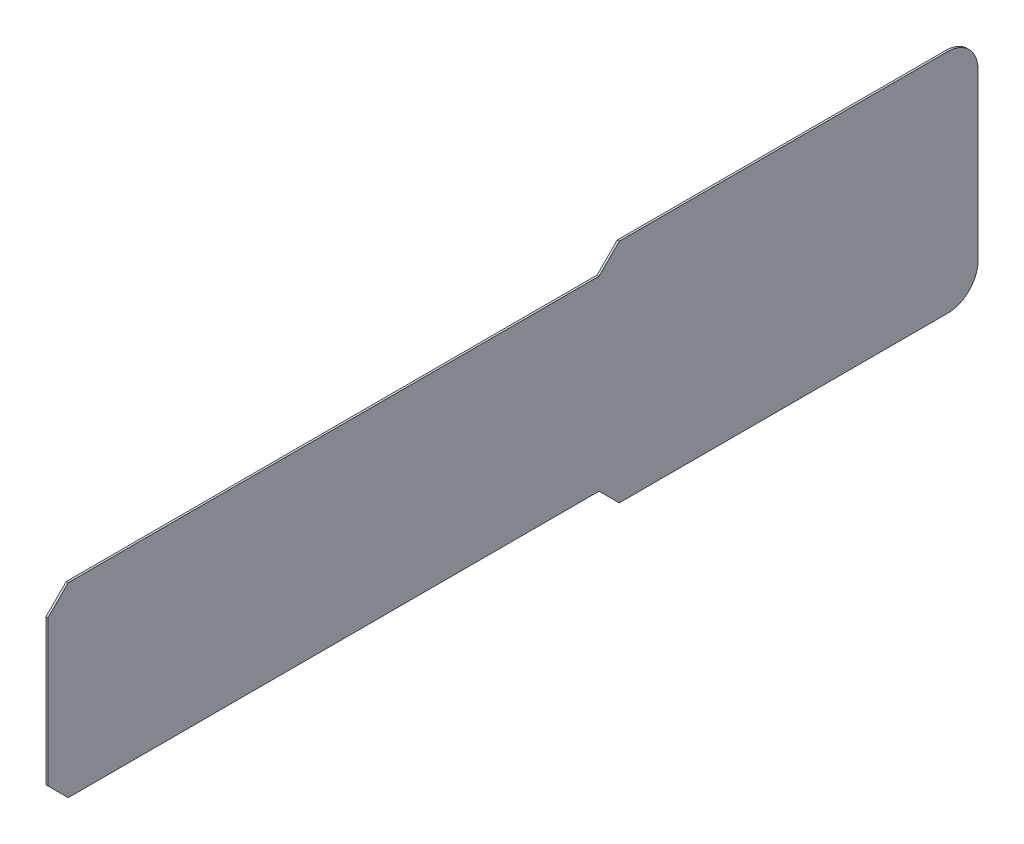
ISO-10303-21;
HEADER;
FILE_DESCRIPTION(('STEP AP214'),'2;1');
FILE_NAME('part.step','',(''),(''),'','','');
FILE_SCHEMA(('AUTOMOTIVE_DESIGN { 1 0 10303 214 1 1 1 1 }'));
ENDSEC;
DATA;
#1=APPLICATION_CONTEXT('core data for automotive mechanical design processes');
#2=APPLICATION_PROTOCOL_DEFINITION('international standard','automotive_design',2000,#1);
#3=PRODUCT_CONTEXT('',#1,'mechanical');
#4=PRODUCT('Part','Part','',(#3));
#5=PRODUCT_RELATED_PRODUCT_CATEGORY('part','',(#4));
#6=PRODUCT_DEFINITION_FORMATION('','',#4);
#7=PRODUCT_DEFINITION_CONTEXT('part definition',#1,'design');
#8=PRODUCT_DEFINITION('design','',#6,#7);
#9=PRODUCT_DEFINITION_SHAPE('','',#8);
#10=(LENGTH_UNIT() NAMED_UNIT(*) SI_UNIT(.MILLI.,.METRE.));
#11=(NAMED_UNIT(*) PLANE_ANGLE_UNIT() SI_UNIT($,.RADIAN.));
#12=(NAMED_UNIT(*) SI_UNIT($,.STERADIAN.) SOLID_ANGLE_UNIT());
#13=UNCERTAINTY_MEASURE_WITH_UNIT(LENGTH_MEASURE(1.E-05),#10,'distance_accuracy_value','');
#14=(GEOMETRIC_REPRESENTATION_CONTEXT(3) GLOBAL_UNCERTAINTY_ASSIGNED_CONTEXT((#13)) GLOBAL_UNIT_ASSIGNED_CONTEXT((#10,
#11,#12)) REPRESENTATION_CONTEXT('',''));
#15=CARTESIAN_POINT('',(0.,0.,0.));
#16=DIRECTION('',(0.,0.,1.));
#17=DIRECTION('',(1.,0.,0.));
#18=AXIS2_PLACEMENT_3D('',#15,#16,#17);
#19=CARTESIAN_POINT('',(-0.2,-35.603076923077,-25.6615384615385));
#20=DIRECTION('',(1.,0.,0.));
#21=DIRECTION('',(0.,0.,-1.));
#22=AXIS2_PLACEMENT_3D('',#19,#20,#21);
#23=CYLINDRICAL_SURFACE('',#22,3.);
#24=DIRECTION('',(1.,0.,0.));
#25=VECTOR('',#24,1.);
#26=CARTESIAN_POINT('',(-0.2,-35.603076923077,-28.6615384615385));
#27=LINE('',#26,#25);
#28=CARTESIAN_POINT('',(-0.2,-35.603076923077,-28.6615384615385));
#29=VERTEX_POINT('',#28);
#30=CARTESIAN_POINT('',(0.,-35.603076923077,-28.6615384615385));
#31=VERTEX_POINT('',#30);
#32=EDGE_CURVE('E189',#29,#31,#27,.T.);
#33=ORIENTED_EDGE('',*,*,#32,.F.);
#34=CARTESIAN_POINT('',(-0.2,-35.603076923077,-25.6615384615385));
#35=DIRECTION('',(1.,0.,0.));
#36=DIRECTION('',(0.,0.,-1.));
#37=AXIS2_PLACEMENT_3D('',#34,#35,#36);
#38=CIRCLE('',#37,3.);
#39=CARTESIAN_POINT('',(-0.2,-32.603076923077,-25.6615384615385));
#40=VERTEX_POINT('',#39);
#41=EDGE_CURVE('E39',#40,#29,#38,.F.);
#42=ORIENTED_EDGE('',*,*,#41,.F.);
#43=DIRECTION('',(1.,0.,0.));
#44=VECTOR('',#43,1.);
#45=CARTESIAN_POINT('',(-0.2,-32.603076923077,-25.6615384615385));
#46=LINE('',#45,#44);
#47=CARTESIAN_POINT('',(0.,-32.603076923077,-25.6615384615385));
#48=VERTEX_POINT('',#47);
#49=EDGE_CURVE('E192',#48,#40,#46,.F.);
#50=ORIENTED_EDGE('',*,*,#49,.F.);
#51=CARTESIAN_POINT('',(0.,-35.603076923077,-25.6615384615385));
#52=DIRECTION('',(1.,0.,0.));
#53=DIRECTION('',(0.,0.,-1.));
#54=AXIS2_PLACEMENT_3D('',#51,#52,#53);
#55=CIRCLE('',#54,3.);
#56=EDGE_CURVE('E11',#31,#48,#55,.T.);
#57=ORIENTED_EDGE('',*,*,#56,.F.);
#58=EDGE_LOOP('',(#33,#42,#50,#57));
#59=FACE_BOUND('',#58,.T.);
#60=ADVANCED_FACE('F32',(#59),#23,.T.);
#61=CARTESIAN_POINT('',(-0.2,-52.0230769230769,-25.6615384615385));
#62=DIRECTION('',(1.,0.,0.));
#63=DIRECTION('',(0.,0.,-1.));
#64=AXIS2_PLACEMENT_3D('',#61,#62,#63);
#65=CYLINDRICAL_SURFACE('',#64,3.);
#66=DIRECTION('',(-1.,0.,0.));
#67=VECTOR('',#66,1.);
#68=CARTESIAN_POINT('',(-0.2,-52.0230769230769,-28.6615384615385));
#69=LINE('',#68,#67);
#70=CARTESIAN_POINT('',(0.,-52.0230769230769,-28.6615384615385));
#71=VERTEX_POINT('',#70);
#72=CARTESIAN_POINT('',(-0.2,-52.0230769230769,-28.6615384615385));
#73=VERTEX_POINT('',#72);
#74=EDGE_CURVE('E171',#71,#73,#69,.T.);
#75=ORIENTED_EDGE('',*,*,#74,.F.);
#76=CARTESIAN_POINT('',(0.,-52.0230769230769,-25.6615384615385));
#77=DIRECTION('',(1.,0.,0.));
#78=DIRECTION('',(0.,0.,-1.));
#79=AXIS2_PLACEMENT_3D('',#76,#77,#78);
#80=CIRCLE('',#79,3.);
#81=CARTESIAN_POINT('',(0.,-55.0230769230769,-25.6615384615385));
#82=VERTEX_POINT('',#81);
#83=EDGE_CURVE('E185',#82,#71,#80,.T.);
#84=ORIENTED_EDGE('',*,*,#83,.F.);
#85=DIRECTION('',(-1.,0.,0.));
#86=VECTOR('',#85,1.);
#87=CARTESIAN_POINT('',(-0.2,-55.0230769230769,-25.6615384615385));
#88=LINE('',#87,#86);
#89=CARTESIAN_POINT('',(-0.2,-55.0230769230769,-25.6615384615385));
#90=VERTEX_POINT('',#89);
#91=EDGE_CURVE('E182',#90,#82,#88,.F.);
#92=ORIENTED_EDGE('',*,*,#91,.F.);
#93=CARTESIAN_POINT('',(-0.2,-52.0230769230769,-25.6615384615385));
#94=DIRECTION('',(1.,0.,0.));
#95=DIRECTION('',(0.,0.,-1.));
#96=AXIS2_PLACEMENT_3D('',#93,#94,#95);
#97=CIRCLE('',#96,3.);
#98=EDGE_CURVE('E187',#73,#90,#97,.F.);
#99=ORIENTED_EDGE('',*,*,#98,.F.);
#100=EDGE_LOOP('',(#75,#84,#92,#99));
#101=FACE_BOUND('',#100,.T.);
#102=ADVANCED_FACE('F206',(#101),#65,.T.);
#103=CARTESIAN_POINT('',(-0.2,-55.0230769230769,-28.6615384615385));
#104=DIRECTION('',(0.,0.,-1.));
#105=DIRECTION('',(-1.,0.,0.));
#106=AXIS2_PLACEMENT_3D('',#103,#104,#105);
#107=PLANE('',#106);
#108=DIRECTION('',(0.,1.,0.));
#109=VECTOR('',#108,1.);
#110=CARTESIAN_POINT('',(-0.2,-55.0230769230769,-28.6615384615385));
#111=LINE('',#110,#109);
#112=EDGE_CURVE('E158',#73,#29,#111,.T.);
#113=ORIENTED_EDGE('',*,*,#112,.T.);
#114=ORIENTED_EDGE('',*,*,#32,.T.);
#115=DIRECTION('',(0.,1.,0.));
#116=VECTOR('',#115,1.);
#117=CARTESIAN_POINT('',(0.,-55.0230769230769,-28.6615384615385));
#118=LINE('',#117,#116);
#119=EDGE_CURVE('E157',#71,#31,#118,.T.);
#120=ORIENTED_EDGE('',*,*,#119,.F.);
#121=ORIENTED_EDGE('',*,*,#74,.T.);
#122=EDGE_LOOP('',(#113,#114,#120,#121));
#123=FACE_BOUND('',#122,.T.);
#124=ADVANCED_FACE('F203',(#123),#107,.T.);
#125=CARTESIAN_POINT('',(-0.2,-55.0230769230769,-28.6615384615385));
#126=DIRECTION('',(0.,1.,0.));
#127=DIRECTION('',(0.,0.,1.));
#128=AXIS2_PLACEMENT_3D('',#125,#126,#127);
#129=PLANE('',#128);
#130=DIRECTION('',(0.,0.,1.));
#131=VECTOR('',#130,1.);
#132=CARTESIAN_POINT('',(0.,-55.0230769230769,-28.6615384615385));
#133=LINE('',#132,#131);
#134=CARTESIAN_POINT('',(0.,-55.0230769230769,6.82846153846155));
#135=VERTEX_POINT('',#134);
#136=EDGE_CURVE('E162',#82,#135,#133,.T.);
#137=ORIENTED_EDGE('',*,*,#136,.T.);
#138=DIRECTION('',(-1.,0.,0.));
#139=VECTOR('',#138,1.);
#140=CARTESIAN_POINT('',(0.,-55.0230769230769,6.82846153846155));
#141=LINE('',#140,#139);
#142=CARTESIAN_POINT('',(-0.200000000000003,-55.0230769230769,6.82846153846155));
#143=VERTEX_POINT('',#142);
#144=EDGE_CURVE('E216',#135,#143,#141,.T.);
#145=ORIENTED_EDGE('',*,*,#144,.T.);
#146=DIRECTION('',(0.,0.,1.));
#147=VECTOR('',#146,1.);
#148=CARTESIAN_POINT('',(-0.2,-55.0230769230769,-28.6615384615385));
#149=LINE('',#148,#147);
#150=EDGE_CURVE('E168',#90,#143,#149,.T.);
#151=ORIENTED_EDGE('',*,*,#150,.F.);
#152=ORIENTED_EDGE('',*,*,#91,.T.);
#153=EDGE_LOOP('',(#137,#145,#151,#152));
#154=FACE_BOUND('',#153,.T.);
#155=ADVANCED_FACE('F214',(#154),#129,.F.);
#156=CARTESIAN_POINT('',(-0.2,-55.0230769230769,63.3384615384615));
#157=DIRECTION('',(0.,0.,-1.));
#158=DIRECTION('',(-1.,0.,0.));
#159=AXIS2_PLACEMENT_3D('',#156,#157,#158);
#160=PLANE('',#159);
#161=DIRECTION('',(0.,1.,0.));
#162=VECTOR('',#161,1.);
#163=CARTESIAN_POINT('',(0.,-55.0230769230769,63.3384615384615));
#164=LINE('',#163,#162);
#165=CARTESIAN_POINT('',(0.,-51.0230769230769,63.3384615384615));
#166=VERTEX_POINT('',#165);
#167=CARTESIAN_POINT('',(0.,-36.603076923077,63.3384615384615));
#168=VERTEX_POINT('',#167);
#169=EDGE_CURVE('E175',#166,#168,#164,.T.);
#170=ORIENTED_EDGE('',*,*,#169,.T.);
#171=DIRECTION('',(-1.,0.,0.));
#172=VECTOR('',#171,1.);
#173=CARTESIAN_POINT('',(0.,-36.603076923077,63.3384615384615));
#174=LINE('',#173,#172);
#175=CARTESIAN_POINT('',(-0.200000000000002,-36.603076923077,63.3384615384615));
#176=VERTEX_POINT('',#175);
#177=EDGE_CURVE('E227',#168,#176,#174,.T.);
#178=ORIENTED_EDGE('',*,*,#177,.T.);
#179=DIRECTION('',(0.,1.,0.));
#180=VECTOR('',#179,1.);
#181=CARTESIAN_POINT('',(-0.2,-55.0230769230769,63.3384615384615));
#182=LINE('',#181,#180);
#183=CARTESIAN_POINT('',(-0.200000000000003,-51.0230769230769,63.3384615384615));
#184=VERTEX_POINT('',#183);
#185=EDGE_CURVE('E165',#184,#176,#182,.T.);
#186=ORIENTED_EDGE('',*,*,#185,.F.);
#187=DIRECTION('',(-1.,0.,0.));
#188=VECTOR('',#187,1.);
#189=CARTESIAN_POINT('',(0.,-51.0230769230769,63.3384615384615));
#190=LINE('',#189,#188);
#191=EDGE_CURVE('E147',#166,#184,#190,.T.);
#192=ORIENTED_EDGE('',*,*,#191,.F.);
#193=EDGE_LOOP('',(#170,#178,#186,#192));
#194=FACE_BOUND('',#193,.T.);
#195=ADVANCED_FACE('F242',(#194),#160,.F.);
#196=CARTESIAN_POINT('',(-0.2,-32.603076923077,-28.6615384615385));
#197=DIRECTION('',(0.,1.,0.));
#198=DIRECTION('',(0.,0.,1.));
#199=AXIS2_PLACEMENT_3D('',#196,#197,#198);
#200=PLANE('',#199);
#201=DIRECTION('',(-1.,0.,0.));
#202=VECTOR('',#201,1.);
#203=CARTESIAN_POINT('',(0.,-32.6030769230769,6.82846153846153));
#204=LINE('',#203,#202);
#205=CARTESIAN_POINT('',(0.,-32.6030769230769,6.82846153846153));
#206=VERTEX_POINT('',#205);
#207=CARTESIAN_POINT('',(-0.200000000000002,-32.6030769230769,6.82846153846153));
#208=VERTEX_POINT('',#207);
#209=EDGE_CURVE('E138',#206,#208,#204,.T.);
#210=ORIENTED_EDGE('',*,*,#209,.F.);
#211=DIRECTION('',(0.,0.,1.));
#212=VECTOR('',#211,1.);
#213=CARTESIAN_POINT('',(0.,-32.603076923077,-28.6615384615385));
#214=LINE('',#213,#212);
#215=EDGE_CURVE('E137',#48,#206,#214,.T.);
#216=ORIENTED_EDGE('',*,*,#215,.F.);
#217=ORIENTED_EDGE('',*,*,#49,.T.);
#218=DIRECTION('',(0.,0.,1.));
#219=VECTOR('',#218,1.);
#220=CARTESIAN_POINT('',(-0.2,-32.603076923077,-28.6615384615385));
#221=LINE('',#220,#219);
#222=EDGE_CURVE('E161',#40,#208,#221,.T.);
#223=ORIENTED_EDGE('',*,*,#222,.T.);
#224=EDGE_LOOP('',(#210,#216,#217,#223));
#225=FACE_BOUND('',#224,.T.);
#226=ADVANCED_FACE('F248',(#225),#200,.T.);
#227=CARTESIAN_POINT('',(-0.2,0.,0.));
#228=DIRECTION('',(1.,0.,0.));
#229=DIRECTION('',(0.,0.,-1.));
#230=AXIS2_PLACEMENT_3D('',#227,#228,#229);
#231=PLANE('',#230);
#232=DIRECTION('',(0.,0.,1.));
#233=VECTOR('',#232,1.);
#234=CARTESIAN_POINT('',(-0.200000000000002,-34.603076923077,8.82846153846154));
#235=LINE('',#234,#233);
#236=CARTESIAN_POINT('',(-0.200000000000002,-34.603076923077,8.82846153846154));
#237=VERTEX_POINT('',#236);
#238=CARTESIAN_POINT('',(-0.200000000000002,-34.603076923077,61.3384615384615));
#239=VERTEX_POINT('',#238);
#240=EDGE_CURVE('E142',#237,#239,#235,.T.);
#241=ORIENTED_EDGE('',*,*,#240,.F.);
#242=DIRECTION('',(0.,-0.70710678118655,0.707106781186545));
#243=VECTOR('',#242,1.);
#244=CARTESIAN_POINT('',(-0.200000000000002,-32.6030769230769,6.82846153846153));
#245=LINE('',#244,#243);
#246=EDGE_CURVE('E124',#208,#237,#245,.T.);
#247=ORIENTED_EDGE('',*,*,#246,.F.);
#248=ORIENTED_EDGE('',*,*,#222,.F.);
#249=ORIENTED_EDGE('',*,*,#41,.T.);
#250=ORIENTED_EDGE('',*,*,#112,.F.);
#251=ORIENTED_EDGE('',*,*,#98,.T.);
#252=ORIENTED_EDGE('',*,*,#150,.T.);
#253=DIRECTION('',(0.,-0.707106781186548,-0.707106781186547));
#254=VECTOR('',#253,1.);
#255=CARTESIAN_POINT('',(-0.200000000000003,-55.0230769230769,6.82846153846155));
#256=LINE('',#255,#254);
#257=CARTESIAN_POINT('',(-0.200000000000003,-53.0230769230769,8.82846153846155));
#258=VERTEX_POINT('',#257);
#259=EDGE_CURVE('E211',#258,#143,#256,.T.);
#260=ORIENTED_EDGE('',*,*,#259,.F.);
#261=DIRECTION('',(0.,0.,-1.));
#262=VECTOR('',#261,1.);
#263=CARTESIAN_POINT('',(-0.200000000000003,-53.0230769230769,8.82846153846155));
#264=LINE('',#263,#262);
#265=CARTESIAN_POINT('',(-0.200000000000003,-53.0230769230769,61.3384615384615));
#266=VERTEX_POINT('',#265);
#267=EDGE_CURVE('E129',#266,#258,#264,.T.);
#268=ORIENTED_EDGE('',*,*,#267,.F.);
#269=DIRECTION('',(0.,-0.707106781186547,-0.707106781186547));
#270=VECTOR('',#269,1.);
#271=CARTESIAN_POINT('',(-0.200000000000003,-53.0230769230769,61.3384615384615));
#272=LINE('',#271,#270);
#273=EDGE_CURVE('E54',#184,#266,#272,.T.);
#274=ORIENTED_EDGE('',*,*,#273,.F.);
#275=ORIENTED_EDGE('',*,*,#185,.T.);
#276=DIRECTION('',(0.,-0.707106781186547,0.707106781186547));
#277=VECTOR('',#276,1.);
#278=CARTESIAN_POINT('',(-0.200000000000002,-34.603076923077,61.3384615384615));
#279=LINE('',#278,#277);
#280=EDGE_CURVE('E219',#239,#176,#279,.T.);
#281=ORIENTED_EDGE('',*,*,#280,.F.);
#282=EDGE_LOOP('',(#241,#247,#248,#249,#250,#251,#252,#260,#268,#274,#275,#281));
#283=FACE_BOUND('',#282,.T.);
#284=ADVANCED_FACE('F198',(#283),#231,.F.);
#285=CARTESIAN_POINT('',(0.,0.,0.));
#286=DIRECTION('',(1.,0.,0.));
#287=DIRECTION('',(0.,0.,-1.));
#288=AXIS2_PLACEMENT_3D('',#285,#286,#287);
#289=PLANE('',#288);
#290=DIRECTION('',(0.,-0.70710678118655,0.707106781186545));
#291=VECTOR('',#290,1.);
#292=CARTESIAN_POINT('',(0.,-32.6030769230769,6.82846153846153));
#293=LINE('',#292,#291);
#294=CARTESIAN_POINT('',(0.,-34.603076923077,8.82846153846154));
#295=VERTEX_POINT('',#294);
#296=EDGE_CURVE('E121',#206,#295,#293,.T.);
#297=ORIENTED_EDGE('',*,*,#296,.T.);
#298=DIRECTION('',(0.,0.,1.));
#299=VECTOR('',#298,1.);
#300=CARTESIAN_POINT('',(0.,-34.603076923077,8.82846153846154));
#301=LINE('',#300,#299);
#302=CARTESIAN_POINT('',(0.,-34.603076923077,61.3384615384615));
#303=VERTEX_POINT('',#302);
#304=EDGE_CURVE('E130',#295,#303,#301,.T.);
#305=ORIENTED_EDGE('',*,*,#304,.T.);
#306=DIRECTION('',(0.,-0.707106781186547,0.707106781186547));
#307=VECTOR('',#306,1.);
#308=CARTESIAN_POINT('',(0.,-34.603076923077,61.3384615384615));
#309=LINE('',#308,#307);
#310=EDGE_CURVE('E46',#303,#168,#309,.T.);
#311=ORIENTED_EDGE('',*,*,#310,.T.);
#312=ORIENTED_EDGE('',*,*,#169,.F.);
#313=DIRECTION('',(0.,-0.707106781186547,-0.707106781186547));
#314=VECTOR('',#313,1.);
#315=CARTESIAN_POINT('',(0.,-53.0230769230769,61.3384615384615));
#316=LINE('',#315,#314);
#317=CARTESIAN_POINT('',(0.,-53.0230769230769,61.3384615384615));
#318=VERTEX_POINT('',#317);
#319=EDGE_CURVE('E231',#166,#318,#316,.T.);
#320=ORIENTED_EDGE('',*,*,#319,.T.);
#321=DIRECTION('',(0.,0.,-1.));
#322=VECTOR('',#321,1.);
#323=CARTESIAN_POINT('',(0.,-53.0230769230769,8.82846153846155));
#324=LINE('',#323,#322);
#325=CARTESIAN_POINT('',(0.,-53.0230769230769,8.82846153846155));
#326=VERTEX_POINT('',#325);
#327=EDGE_CURVE('E150',#318,#326,#324,.T.);
#328=ORIENTED_EDGE('',*,*,#327,.T.);
#329=DIRECTION('',(0.,-0.707106781186548,-0.707106781186547));
#330=VECTOR('',#329,1.);
#331=CARTESIAN_POINT('',(0.,-55.0230769230769,6.82846153846155));
#332=LINE('',#331,#330);
#333=EDGE_CURVE('E220',#326,#135,#332,.T.);
#334=ORIENTED_EDGE('',*,*,#333,.T.);
#335=ORIENTED_EDGE('',*,*,#136,.F.);
#336=ORIENTED_EDGE('',*,*,#83,.T.);
#337=ORIENTED_EDGE('',*,*,#119,.T.);
#338=ORIENTED_EDGE('',*,*,#56,.T.);
#339=ORIENTED_EDGE('',*,*,#215,.T.);
#340=EDGE_LOOP('',(#297,#305,#311,#312,#320,#328,#334,#335,#336,#337,#338,#339));
#341=FACE_BOUND('',#340,.T.);
#342=ADVANCED_FACE('F135',(#341),#289,.T.);
#343=CARTESIAN_POINT('',(0.,-53.0230769230769,8.82846153846155));
#344=DIRECTION('',(0.,1.,0.));
#345=DIRECTION('',(-1.,0.,0.));
#346=AXIS2_PLACEMENT_3D('',#343,#344,#345);
#347=PLANE('',#346);
#348=ORIENTED_EDGE('',*,*,#327,.F.);
#349=DIRECTION('',(-1.,0.,0.));
#350=VECTOR('',#349,1.);
#351=CARTESIAN_POINT('',(0.,-53.0230769230769,61.3384615384615));
#352=LINE('',#351,#350);
#353=EDGE_CURVE('E144',#318,#266,#352,.T.);
#354=ORIENTED_EDGE('',*,*,#353,.T.);
#355=ORIENTED_EDGE('',*,*,#267,.T.);
#356=DIRECTION('',(-1.,0.,0.));
#357=VECTOR('',#356,1.);
#358=CARTESIAN_POINT('',(0.,-53.0230769230769,8.82846153846155));
#359=LINE('',#358,#357);
#360=EDGE_CURVE('E153',#326,#258,#359,.T.);
#361=ORIENTED_EDGE('',*,*,#360,.F.);
#362=EDGE_LOOP('',(#348,#354,#355,#361));
#363=FACE_BOUND('',#362,.T.);
#364=ADVANCED_FACE('F245',(#363),#347,.F.);
#365=CARTESIAN_POINT('',(0.,-34.603076923077,8.82846153846154));
#366=DIRECTION('',(0.,-1.,0.));
#367=DIRECTION('',(0.,0.,-1.));
#368=AXIS2_PLACEMENT_3D('',#365,#366,#367);
#369=PLANE('',#368);
#370=ORIENTED_EDGE('',*,*,#240,.T.);
#371=DIRECTION('',(-1.,0.,0.));
#372=VECTOR('',#371,1.);
#373=CARTESIAN_POINT('',(0.,-34.603076923077,61.3384615384615));
#374=LINE('',#373,#372);
#375=EDGE_CURVE('E141',#303,#239,#374,.T.);
#376=ORIENTED_EDGE('',*,*,#375,.F.);
#377=ORIENTED_EDGE('',*,*,#304,.F.);
#378=DIRECTION('',(-1.,0.,0.));
#379=VECTOR('',#378,1.);
#380=CARTESIAN_POINT('',(0.,-34.603076923077,8.82846153846154));
#381=LINE('',#380,#379);
#382=EDGE_CURVE('E118',#295,#237,#381,.T.);
#383=ORIENTED_EDGE('',*,*,#382,.T.);
#384=EDGE_LOOP('',(#370,#376,#377,#383));
#385=FACE_BOUND('',#384,.T.);
#386=ADVANCED_FACE('F140',(#385),#369,.F.);
#387=CARTESIAN_POINT('',(0.,-53.0230769230769,61.3384615384615));
#388=DIRECTION('',(0.,0.707106781186548,-0.707106781186548));
#389=DIRECTION('',(0.,0.707106781186548,0.707106781186548));
#390=AXIS2_PLACEMENT_3D('',#387,#388,#389);
#391=PLANE('',#390);
#392=ORIENTED_EDGE('',*,*,#273,.T.);
#393=ORIENTED_EDGE('',*,*,#353,.F.);
#394=ORIENTED_EDGE('',*,*,#319,.F.);
#395=ORIENTED_EDGE('',*,*,#191,.T.);
#396=EDGE_LOOP('',(#392,#393,#394,#395));
#397=FACE_BOUND('',#396,.T.);
#398=ADVANCED_FACE('F237',(#397),#391,.F.);
#399=CARTESIAN_POINT('',(0.,-34.603076923077,61.3384615384615));
#400=DIRECTION('',(0.,-0.707106781186548,-0.707106781186548));
#401=DIRECTION('',(0.,0.707106781186548,-0.707106781186548));
#402=AXIS2_PLACEMENT_3D('',#399,#400,#401);
#403=PLANE('',#402);
#404=ORIENTED_EDGE('',*,*,#280,.T.);
#405=ORIENTED_EDGE('',*,*,#177,.F.);
#406=ORIENTED_EDGE('',*,*,#310,.F.);
#407=ORIENTED_EDGE('',*,*,#375,.T.);
#408=EDGE_LOOP('',(#404,#405,#406,#407));
#409=FACE_BOUND('',#408,.T.);
#410=ADVANCED_FACE('F243',(#409),#403,.F.);
#411=CARTESIAN_POINT('',(0.,-55.0230769230769,6.82846153846155));
#412=DIRECTION('',(0.,0.707106781186547,-0.707106781186548));
#413=DIRECTION('',(0.,0.707106781186548,0.707106781186547));
#414=AXIS2_PLACEMENT_3D('',#411,#412,#413);
#415=PLANE('',#414);
#416=ORIENTED_EDGE('',*,*,#259,.T.);
#417=ORIENTED_EDGE('',*,*,#144,.F.);
#418=ORIENTED_EDGE('',*,*,#333,.F.);
#419=ORIENTED_EDGE('',*,*,#360,.T.);
#420=EDGE_LOOP('',(#416,#417,#418,#419));
#421=FACE_BOUND('',#420,.T.);
#422=ADVANCED_FACE('F246',(#421),#415,.F.);
#423=CARTESIAN_POINT('',(0.,-32.6030769230769,6.82846153846153));
#424=DIRECTION('',(0.,-0.707106781186545,-0.70710678118655));
#425=DIRECTION('',(0.,0.70710678118655,-0.707106781186545));
#426=AXIS2_PLACEMENT_3D('',#423,#424,#425);
#427=PLANE('',#426);
#428=ORIENTED_EDGE('',*,*,#246,.T.);
#429=ORIENTED_EDGE('',*,*,#382,.F.);
#430=ORIENTED_EDGE('',*,*,#296,.F.);
#431=ORIENTED_EDGE('',*,*,#209,.T.);
#432=EDGE_LOOP('',(#428,#429,#430,#431));
#433=FACE_BOUND('',#432,.T.);
#434=ADVANCED_FACE('F120',(#433),#427,.F.);
#435=CLOSED_SHELL('',(#60,#102,#124,#155,#195,#226,#284,#342,#364,#386,#398,#410,#422,#434));
#436=MANIFOLD_SOLID_BREP('B2',#435);
#437=ADVANCED_BREP_SHAPE_REPRESENTATION('',(#18,#436),#14);
#438=SHAPE_DEFINITION_REPRESENTATION(#9,#437);
ENDSEC;
END-ISO-10303-21;
